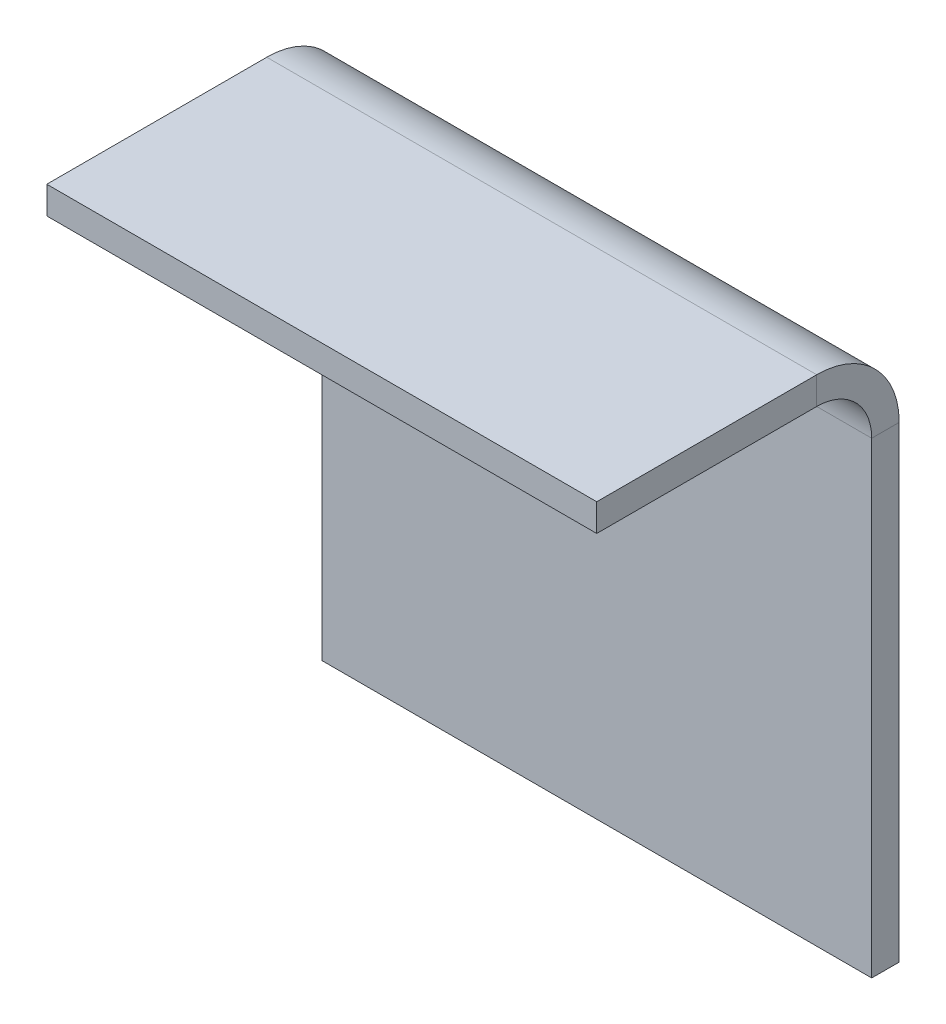
ISO-10303-21;
HEADER;
FILE_DESCRIPTION(('STEP AP214'),'2;1');
FILE_NAME('part.step','',(''),(''),'','','');
FILE_SCHEMA(('AUTOMOTIVE_DESIGN { 1 0 10303 214 1 1 1 1 }'));
ENDSEC;
DATA;
#1=APPLICATION_CONTEXT('core data for automotive mechanical design processes');
#2=APPLICATION_PROTOCOL_DEFINITION('international standard','automotive_design',2000,#1);
#3=PRODUCT_CONTEXT('',#1,'mechanical');
#4=PRODUCT('Part','Part','',(#3));
#5=PRODUCT_RELATED_PRODUCT_CATEGORY('part','',(#4));
#6=PRODUCT_DEFINITION_FORMATION('','',#4);
#7=PRODUCT_DEFINITION_CONTEXT('part definition',#1,'design');
#8=PRODUCT_DEFINITION('design','',#6,#7);
#9=PRODUCT_DEFINITION_SHAPE('','',#8);
#10=(LENGTH_UNIT() NAMED_UNIT(*) SI_UNIT(.MILLI.,.METRE.));
#11=(NAMED_UNIT(*) PLANE_ANGLE_UNIT() SI_UNIT($,.RADIAN.));
#12=(NAMED_UNIT(*) SI_UNIT($,.STERADIAN.) SOLID_ANGLE_UNIT());
#13=UNCERTAINTY_MEASURE_WITH_UNIT(LENGTH_MEASURE(1.E-05),#10,'distance_accuracy_value','');
#14=(GEOMETRIC_REPRESENTATION_CONTEXT(3) GLOBAL_UNCERTAINTY_ASSIGNED_CONTEXT((#13)) GLOBAL_UNIT_ASSIGNED_CONTEXT((#10,
#11,#12)) REPRESENTATION_CONTEXT('',''));
#15=CARTESIAN_POINT('',(0.,0.,0.));
#16=DIRECTION('',(0.,0.,1.));
#17=DIRECTION('',(1.,0.,0.));
#18=AXIS2_PLACEMENT_3D('',#15,#16,#17);
#19=CARTESIAN_POINT('',(0.,0.,-1.));
#20=DIRECTION('',(-1.,0.,0.));
#21=DIRECTION('',(0.,0.,1.));
#22=AXIS2_PLACEMENT_3D('',#19,#20,#21);
#23=PLANE('',#22);
#24=DIRECTION('',(0.,-1.,0.));
#25=VECTOR('',#24,1.);
#26=CARTESIAN_POINT('',(0.,0.,0.));
#27=LINE('',#26,#25);
#28=CARTESIAN_POINT('',(0.,17.,0.));
#29=VERTEX_POINT('',#28);
#30=CARTESIAN_POINT('',(0.,0.,0.));
#31=VERTEX_POINT('',#30);
#32=EDGE_CURVE('E192',#29,#31,#27,.T.);
#33=ORIENTED_EDGE('',*,*,#32,.F.);
#34=DIRECTION('',(0.,0.,-1.));
#35=VECTOR('',#34,1.);
#36=CARTESIAN_POINT('',(0.,17.,0.));
#37=LINE('',#36,#35);
#38=CARTESIAN_POINT('',(0.,17.,-1.));
#39=VERTEX_POINT('',#38);
#40=EDGE_CURVE('E180',#29,#39,#37,.T.);
#41=ORIENTED_EDGE('',*,*,#40,.T.);
#42=DIRECTION('',(0.,-1.,0.));
#43=VECTOR('',#42,1.);
#44=CARTESIAN_POINT('',(0.,0.,-1.));
#45=LINE('',#44,#43);
#46=CARTESIAN_POINT('',(0.,0.,-1.));
#47=VERTEX_POINT('',#46);
#48=EDGE_CURVE('E191',#39,#47,#45,.T.);
#49=ORIENTED_EDGE('',*,*,#48,.T.);
#50=DIRECTION('',(0.,0.,1.));
#51=VECTOR('',#50,1.);
#52=CARTESIAN_POINT('',(0.,0.,-1.));
#53=LINE('',#52,#51);
#54=EDGE_CURVE('E70',#47,#31,#53,.T.);
#55=ORIENTED_EDGE('',*,*,#54,.T.);
#56=EDGE_LOOP('',(#33,#41,#49,#55));
#57=FACE_BOUND('',#56,.T.);
#58=ADVANCED_FACE('F61',(#57),#23,.T.);
#59=CARTESIAN_POINT('',(20.,0.,-1.));
#60=DIRECTION('',(1.,0.,0.));
#61=DIRECTION('',(0.,0.,-1.));
#62=AXIS2_PLACEMENT_3D('',#59,#60,#61);
#63=PLANE('',#62);
#64=DIRECTION('',(0.,1.,0.));
#65=VECTOR('',#64,1.);
#66=CARTESIAN_POINT('',(20.,0.,0.));
#67=LINE('',#66,#65);
#68=CARTESIAN_POINT('',(20.,0.,0.));
#69=VERTEX_POINT('',#68);
#70=CARTESIAN_POINT('',(20.,17.,0.));
#71=VERTEX_POINT('',#70);
#72=EDGE_CURVE('E197',#69,#71,#67,.T.);
#73=ORIENTED_EDGE('',*,*,#72,.F.);
#74=DIRECTION('',(0.,0.,1.));
#75=VECTOR('',#74,1.);
#76=CARTESIAN_POINT('',(20.,0.,-1.));
#77=LINE('',#76,#75);
#78=CARTESIAN_POINT('',(20.,0.,-1.));
#79=VERTEX_POINT('',#78);
#80=EDGE_CURVE('E13',#79,#69,#77,.T.);
#81=ORIENTED_EDGE('',*,*,#80,.F.);
#82=DIRECTION('',(0.,1.,0.));
#83=VECTOR('',#82,1.);
#84=CARTESIAN_POINT('',(20.,0.,-1.));
#85=LINE('',#84,#83);
#86=CARTESIAN_POINT('',(20.,17.,-1.));
#87=VERTEX_POINT('',#86);
#88=EDGE_CURVE('E199',#79,#87,#85,.T.);
#89=ORIENTED_EDGE('',*,*,#88,.T.);
#90=DIRECTION('',(0.,0.,-1.));
#91=VECTOR('',#90,1.);
#92=CARTESIAN_POINT('',(20.,17.,0.));
#93=LINE('',#92,#91);
#94=EDGE_CURVE('E190',#71,#87,#93,.T.);
#95=ORIENTED_EDGE('',*,*,#94,.F.);
#96=EDGE_LOOP('',(#73,#81,#89,#95));
#97=FACE_BOUND('',#96,.T.);
#98=ADVANCED_FACE('F215',(#97),#63,.T.);
#99=CARTESIAN_POINT('',(0.,0.,-1.));
#100=DIRECTION('',(0.,-1.,0.));
#101=DIRECTION('',(0.,0.,-1.));
#102=AXIS2_PLACEMENT_3D('',#99,#100,#101);
#103=PLANE('',#102);
#104=DIRECTION('',(1.,0.,0.));
#105=VECTOR('',#104,1.);
#106=CARTESIAN_POINT('',(0.,0.,0.));
#107=LINE('',#106,#105);
#108=EDGE_CURVE('E204',#31,#69,#107,.T.);
#109=ORIENTED_EDGE('',*,*,#108,.F.);
#110=ORIENTED_EDGE('',*,*,#54,.F.);
#111=DIRECTION('',(1.,0.,0.));
#112=VECTOR('',#111,1.);
#113=CARTESIAN_POINT('',(0.,0.,-1.));
#114=LINE('',#113,#112);
#115=EDGE_CURVE('E198',#47,#79,#114,.T.);
#116=ORIENTED_EDGE('',*,*,#115,.T.);
#117=ORIENTED_EDGE('',*,*,#80,.T.);
#118=EDGE_LOOP('',(#109,#110,#116,#117));
#119=FACE_BOUND('',#118,.T.);
#120=ADVANCED_FACE('F236',(#119),#103,.T.);
#121=CARTESIAN_POINT('',(0.,0.,-1.));
#122=DIRECTION('',(0.,0.,-1.));
#123=DIRECTION('',(-1.,0.,0.));
#124=AXIS2_PLACEMENT_3D('',#121,#122,#123);
#125=PLANE('',#124);
#126=ORIENTED_EDGE('',*,*,#48,.F.);
#127=DIRECTION('',(-1.,0.,0.));
#128=VECTOR('',#127,1.);
#129=CARTESIAN_POINT('',(0.,17.,-1.));
#130=LINE('',#129,#128);
#131=EDGE_CURVE('E172',#39,#87,#130,.F.);
#132=ORIENTED_EDGE('',*,*,#131,.T.);
#133=ORIENTED_EDGE('',*,*,#88,.F.);
#134=ORIENTED_EDGE('',*,*,#115,.F.);
#135=EDGE_LOOP('',(#126,#132,#133,#134));
#136=FACE_BOUND('',#135,.T.);
#137=ADVANCED_FACE('F232',(#136),#125,.T.);
#138=CARTESIAN_POINT('',(0.,0.,0.));
#139=DIRECTION('',(0.,0.,-1.));
#140=DIRECTION('',(-1.,0.,0.));
#141=AXIS2_PLACEMENT_3D('',#138,#139,#140);
#142=PLANE('',#141);
#143=ORIENTED_EDGE('',*,*,#32,.T.);
#144=ORIENTED_EDGE('',*,*,#108,.T.);
#145=ORIENTED_EDGE('',*,*,#72,.T.);
#146=DIRECTION('',(-1.,0.,0.));
#147=VECTOR('',#146,1.);
#148=CARTESIAN_POINT('',(0.,17.,0.));
#149=LINE('',#148,#147);
#150=EDGE_CURVE('E184',#29,#71,#149,.F.);
#151=ORIENTED_EDGE('',*,*,#150,.F.);
#152=EDGE_LOOP('',(#143,#144,#145,#151));
#153=FACE_BOUND('',#152,.T.);
#154=ADVANCED_FACE('F211',(#153),#142,.F.);
#155=CARTESIAN_POINT('',(20.,17.,2.));
#156=DIRECTION('',(1.,0.,0.));
#157=DIRECTION('',(0.,0.,-1.));
#158=AXIS2_PLACEMENT_3D('',#155,#156,#157);
#159=PLANE('',#158);
#160=DIRECTION('',(0.,-1.,0.));
#161=VECTOR('',#160,1.);
#162=CARTESIAN_POINT('',(20.,20.,2.));
#163=LINE('',#162,#161);
#164=CARTESIAN_POINT('',(20.,19.,2.));
#165=VERTEX_POINT('',#164);
#166=CARTESIAN_POINT('',(20.,20.,2.));
#167=VERTEX_POINT('',#166);
#168=EDGE_CURVE('E156',#165,#167,#163,.F.);
#169=ORIENTED_EDGE('',*,*,#168,.F.);
#170=CARTESIAN_POINT('',(20.,17.,2.));
#171=DIRECTION('',(-1.,0.,0.));
#172=DIRECTION('',(0.,0.,1.));
#173=AXIS2_PLACEMENT_3D('',#170,#171,#172);
#174=CIRCLE('',#173,2.);
#175=EDGE_CURVE('E182',#71,#165,#174,.F.);
#176=ORIENTED_EDGE('',*,*,#175,.F.);
#177=ORIENTED_EDGE('',*,*,#94,.T.);
#178=CARTESIAN_POINT('',(20.,17.,2.));
#179=DIRECTION('',(-1.,0.,0.));
#180=DIRECTION('',(0.,0.,1.));
#181=AXIS2_PLACEMENT_3D('',#178,#179,#180);
#182=CIRCLE('',#181,3.);
#183=EDGE_CURVE('E100',#87,#167,#182,.F.);
#184=ORIENTED_EDGE('',*,*,#183,.T.);
#185=EDGE_LOOP('',(#169,#176,#177,#184));
#186=FACE_BOUND('',#185,.T.);
#187=ADVANCED_FACE('F214',(#186),#159,.T.);
#188=CARTESIAN_POINT('',(0.,17.,2.));
#189=DIRECTION('',(1.,0.,0.));
#190=DIRECTION('',(0.,0.,-1.));
#191=AXIS2_PLACEMENT_3D('',#188,#189,#190);
#192=PLANE('',#191);
#193=CARTESIAN_POINT('',(0.,17.,2.));
#194=DIRECTION('',(-1.,0.,0.));
#195=DIRECTION('',(0.,0.,1.));
#196=AXIS2_PLACEMENT_3D('',#193,#194,#195);
#197=CIRCLE('',#196,2.);
#198=CARTESIAN_POINT('',(0.,19.,2.));
#199=VERTEX_POINT('',#198);
#200=EDGE_CURVE('E188',#199,#29,#197,.T.);
#201=ORIENTED_EDGE('',*,*,#200,.F.);
#202=DIRECTION('',(0.,-1.,0.));
#203=VECTOR('',#202,1.);
#204=CARTESIAN_POINT('',(0.,19.,2.));
#205=LINE('',#204,#203);
#206=CARTESIAN_POINT('',(0.,20.,2.));
#207=VERTEX_POINT('',#206);
#208=EDGE_CURVE('E170',#199,#207,#205,.F.);
#209=ORIENTED_EDGE('',*,*,#208,.T.);
#210=CARTESIAN_POINT('',(0.,17.,2.));
#211=DIRECTION('',(-1.,0.,0.));
#212=DIRECTION('',(0.,0.,1.));
#213=AXIS2_PLACEMENT_3D('',#210,#211,#212);
#214=CIRCLE('',#213,3.);
#215=EDGE_CURVE('E177',#207,#39,#214,.T.);
#216=ORIENTED_EDGE('',*,*,#215,.T.);
#217=ORIENTED_EDGE('',*,*,#40,.F.);
#218=EDGE_LOOP('',(#201,#209,#216,#217));
#219=FACE_BOUND('',#218,.T.);
#220=ADVANCED_FACE('F229',(#219),#192,.F.);
#221=CARTESIAN_POINT('',(0.,17.,2.));
#222=DIRECTION('',(-1.,0.,0.));
#223=DIRECTION('',(0.,1.,0.));
#224=AXIS2_PLACEMENT_3D('',#221,#222,#223);
#225=CYLINDRICAL_SURFACE('',#224,3.);
#226=ORIENTED_EDGE('',*,*,#131,.F.);
#227=ORIENTED_EDGE('',*,*,#215,.F.);
#228=DIRECTION('',(-1.,0.,0.));
#229=VECTOR('',#228,1.);
#230=CARTESIAN_POINT('',(20.,20.,2.));
#231=LINE('',#230,#229);
#232=EDGE_CURVE('E164',#207,#167,#231,.F.);
#233=ORIENTED_EDGE('',*,*,#232,.T.);
#234=ORIENTED_EDGE('',*,*,#183,.F.);
#235=EDGE_LOOP('',(#226,#227,#233,#234));
#236=FACE_BOUND('',#235,.T.);
#237=ADVANCED_FACE('F230',(#236),#225,.T.);
#238=CARTESIAN_POINT('',(0.,17.,2.));
#239=DIRECTION('',(-1.,0.,0.));
#240=DIRECTION('',(0.,1.,0.));
#241=AXIS2_PLACEMENT_3D('',#238,#239,#240);
#242=CYLINDRICAL_SURFACE('',#241,2.);
#243=ORIENTED_EDGE('',*,*,#150,.T.);
#244=ORIENTED_EDGE('',*,*,#175,.T.);
#245=DIRECTION('',(-1.,0.,0.));
#246=VECTOR('',#245,1.);
#247=CARTESIAN_POINT('',(20.,19.,2.));
#248=LINE('',#247,#246);
#249=EDGE_CURVE('E168',#165,#199,#248,.T.);
#250=ORIENTED_EDGE('',*,*,#249,.T.);
#251=ORIENTED_EDGE('',*,*,#200,.T.);
#252=EDGE_LOOP('',(#243,#244,#250,#251));
#253=FACE_BOUND('',#252,.T.);
#254=ADVANCED_FACE('F217',(#253),#242,.F.);
#255=CARTESIAN_POINT('',(20.,20.,0.));
#256=DIRECTION('',(-1.,0.,0.));
#257=DIRECTION('',(0.,0.,1.));
#258=AXIS2_PLACEMENT_3D('',#255,#256,#257);
#259=PLANE('',#258);
#260=ORIENTED_EDGE('',*,*,#168,.T.);
#261=DIRECTION('',(0.,0.,-1.));
#262=VECTOR('',#261,1.);
#263=CARTESIAN_POINT('',(20.,20.,0.));
#264=LINE('',#263,#262);
#265=CARTESIAN_POINT('',(20.,20.,10.));
#266=VERTEX_POINT('',#265);
#267=EDGE_CURVE('E139',#266,#167,#264,.T.);
#268=ORIENTED_EDGE('',*,*,#267,.F.);
#269=DIRECTION('',(0.,-1.,0.));
#270=VECTOR('',#269,1.);
#271=CARTESIAN_POINT('',(20.,20.,10.));
#272=LINE('',#271,#270);
#273=CARTESIAN_POINT('',(20.,19.,10.));
#274=VERTEX_POINT('',#273);
#275=EDGE_CURVE('E141',#266,#274,#272,.T.);
#276=ORIENTED_EDGE('',*,*,#275,.T.);
#277=DIRECTION('',(0.,0.,1.));
#278=VECTOR('',#277,1.);
#279=CARTESIAN_POINT('',(20.,19.,0.));
#280=LINE('',#279,#278);
#281=EDGE_CURVE('E162',#274,#165,#280,.F.);
#282=ORIENTED_EDGE('',*,*,#281,.T.);
#283=EDGE_LOOP('',(#260,#268,#276,#282));
#284=FACE_BOUND('',#283,.T.);
#285=ADVANCED_FACE('F154',(#284),#259,.F.);
#286=CARTESIAN_POINT('',(0.,20.,0.));
#287=DIRECTION('',(1.,0.,0.));
#288=DIRECTION('',(0.,0.,-1.));
#289=AXIS2_PLACEMENT_3D('',#286,#287,#288);
#290=PLANE('',#289);
#291=ORIENTED_EDGE('',*,*,#208,.F.);
#292=DIRECTION('',(0.,0.,-1.));
#293=VECTOR('',#292,1.);
#294=CARTESIAN_POINT('',(0.,19.,0.));
#295=LINE('',#294,#293);
#296=CARTESIAN_POINT('',(0.,19.,10.));
#297=VERTEX_POINT('',#296);
#298=EDGE_CURVE('E157',#199,#297,#295,.F.);
#299=ORIENTED_EDGE('',*,*,#298,.T.);
#300=DIRECTION('',(0.,-1.,0.));
#301=VECTOR('',#300,1.);
#302=CARTESIAN_POINT('',(0.,20.,10.));
#303=LINE('',#302,#301);
#304=CARTESIAN_POINT('',(0.,20.,10.));
#305=VERTEX_POINT('',#304);
#306=EDGE_CURVE('E155',#305,#297,#303,.T.);
#307=ORIENTED_EDGE('',*,*,#306,.F.);
#308=DIRECTION('',(0.,0.,1.));
#309=VECTOR('',#308,1.);
#310=CARTESIAN_POINT('',(0.,20.,0.));
#311=LINE('',#310,#309);
#312=EDGE_CURVE('E136',#207,#305,#311,.T.);
#313=ORIENTED_EDGE('',*,*,#312,.F.);
#314=EDGE_LOOP('',(#291,#299,#307,#313));
#315=FACE_BOUND('',#314,.T.);
#316=ADVANCED_FACE('F223',(#315),#290,.F.);
#317=CARTESIAN_POINT('',(0.,20.,0.));
#318=DIRECTION('',(0.,-1.,0.));
#319=DIRECTION('',(0.,0.,-1.));
#320=AXIS2_PLACEMENT_3D('',#317,#318,#319);
#321=PLANE('',#320);
#322=ORIENTED_EDGE('',*,*,#232,.F.);
#323=ORIENTED_EDGE('',*,*,#312,.T.);
#324=DIRECTION('',(1.,0.,0.));
#325=VECTOR('',#324,1.);
#326=CARTESIAN_POINT('',(0.,20.,10.));
#327=LINE('',#326,#325);
#328=EDGE_CURVE('E134',#305,#266,#327,.T.);
#329=ORIENTED_EDGE('',*,*,#328,.T.);
#330=ORIENTED_EDGE('',*,*,#267,.T.);
#331=EDGE_LOOP('',(#322,#323,#329,#330));
#332=FACE_BOUND('',#331,.T.);
#333=ADVANCED_FACE('F131',(#332),#321,.F.);
#334=CARTESIAN_POINT('',(0.,19.,0.));
#335=DIRECTION('',(0.,-1.,0.));
#336=DIRECTION('',(0.,0.,-1.));
#337=AXIS2_PLACEMENT_3D('',#334,#335,#336);
#338=PLANE('',#337);
#339=ORIENTED_EDGE('',*,*,#298,.F.);
#340=ORIENTED_EDGE('',*,*,#249,.F.);
#341=ORIENTED_EDGE('',*,*,#281,.F.);
#342=DIRECTION('',(-1.,0.,0.));
#343=VECTOR('',#342,1.);
#344=CARTESIAN_POINT('',(20.,19.,10.));
#345=LINE('',#344,#343);
#346=EDGE_CURVE('E146',#297,#274,#345,.F.);
#347=ORIENTED_EDGE('',*,*,#346,.F.);
#348=EDGE_LOOP('',(#339,#340,#341,#347));
#349=FACE_BOUND('',#348,.T.);
#350=ADVANCED_FACE('F225',(#349),#338,.T.);
#351=CARTESIAN_POINT('',(20.,20.,10.));
#352=DIRECTION('',(0.,0.,-1.));
#353=DIRECTION('',(0.,1.,0.));
#354=AXIS2_PLACEMENT_3D('',#351,#352,#353);
#355=PLANE('',#354);
#356=ORIENTED_EDGE('',*,*,#346,.T.);
#357=ORIENTED_EDGE('',*,*,#275,.F.);
#358=ORIENTED_EDGE('',*,*,#328,.F.);
#359=ORIENTED_EDGE('',*,*,#306,.T.);
#360=EDGE_LOOP('',(#356,#357,#358,#359));
#361=FACE_BOUND('',#360,.T.);
#362=ADVANCED_FACE('F148',(#361),#355,.F.);
#363=CLOSED_SHELL('',(#58,#98,#120,#137,#154,#187,#220,#237,#254,#285,#316,#333,#350,#362));
#364=MANIFOLD_SOLID_BREP('B2',#363);
#365=ADVANCED_BREP_SHAPE_REPRESENTATION('',(#18,#364),#14);
#366=SHAPE_DEFINITION_REPRESENTATION(#9,#365);
ENDSEC;
END-ISO-10303-21;
